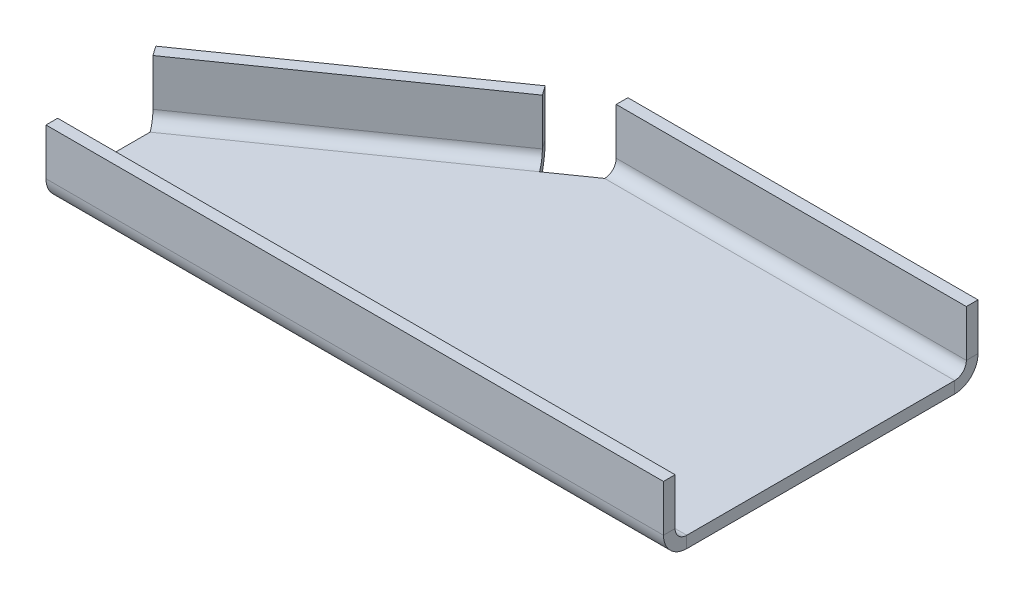
ISO-10303-21;
HEADER;
FILE_DESCRIPTION(('STEP AP214'),'2;1');
FILE_NAME('part.step','',(''),(''),'','','');
FILE_SCHEMA(('AUTOMOTIVE_DESIGN { 1 0 10303 214 1 1 1 1 }'));
ENDSEC;
DATA;
#1=APPLICATION_CONTEXT('core data for automotive mechanical design processes');
#2=APPLICATION_PROTOCOL_DEFINITION('international standard','automotive_design',2000,#1);
#3=PRODUCT_CONTEXT('',#1,'mechanical');
#4=PRODUCT('Part','Part','',(#3));
#5=PRODUCT_RELATED_PRODUCT_CATEGORY('part','',(#4));
#6=PRODUCT_DEFINITION_FORMATION('','',#4);
#7=PRODUCT_DEFINITION_CONTEXT('part definition',#1,'design');
#8=PRODUCT_DEFINITION('design','',#6,#7);
#9=PRODUCT_DEFINITION_SHAPE('','',#8);
#10=(LENGTH_UNIT() NAMED_UNIT(*) SI_UNIT(.MILLI.,.METRE.));
#11=(NAMED_UNIT(*) PLANE_ANGLE_UNIT() SI_UNIT($,.RADIAN.));
#12=(NAMED_UNIT(*) SI_UNIT($,.STERADIAN.) SOLID_ANGLE_UNIT());
#13=UNCERTAINTY_MEASURE_WITH_UNIT(LENGTH_MEASURE(1.E-05),#10,'distance_accuracy_value','');
#14=(GEOMETRIC_REPRESENTATION_CONTEXT(3) GLOBAL_UNCERTAINTY_ASSIGNED_CONTEXT((#13)) GLOBAL_UNIT_ASSIGNED_CONTEXT((#10,
#11,#12)) REPRESENTATION_CONTEXT('',''));
#15=CARTESIAN_POINT('',(0.,0.,0.));
#16=DIRECTION('',(0.,0.,1.));
#17=DIRECTION('',(1.,0.,0.));
#18=AXIS2_PLACEMENT_3D('',#15,#16,#17);
#19=CARTESIAN_POINT('',(168.275,-3.175,-79.375));
#20=DIRECTION('',(1.,0.,0.));
#21=DIRECTION('',(0.,0.,-1.));
#22=AXIS2_PLACEMENT_3D('',#19,#20,#21);
#23=PLANE('',#22);
#24=DIRECTION('',(0.,0.,-1.));
#25=VECTOR('',#24,1.);
#26=CARTESIAN_POINT('',(168.275,0.,-79.375));
#27=LINE('',#26,#25);
#28=CARTESIAN_POINT('',(168.275,0.,-6.34999999999999));
#29=VERTEX_POINT('',#28);
#30=CARTESIAN_POINT('',(168.275,0.,-79.375));
#31=VERTEX_POINT('',#30);
#32=EDGE_CURVE('E143',#29,#31,#27,.T.);
#33=ORIENTED_EDGE('',*,*,#32,.F.);
#34=DIRECTION('',(0.,1.,0.));
#35=VECTOR('',#34,1.);
#36=CARTESIAN_POINT('',(168.275,-3.175,-6.34999999999999));
#37=LINE('',#36,#35);
#38=CARTESIAN_POINT('',(168.275,-3.17500000000001,-6.35));
#39=VERTEX_POINT('',#38);
#40=EDGE_CURVE('E13',#39,#29,#37,.T.);
#41=ORIENTED_EDGE('',*,*,#40,.F.);
#42=DIRECTION('',(0.,0.,-1.));
#43=VECTOR('',#42,1.);
#44=CARTESIAN_POINT('',(168.275,-3.175,-79.375));
#45=LINE('',#44,#43);
#46=CARTESIAN_POINT('',(168.275,-3.175,-79.375));
#47=VERTEX_POINT('',#46);
#48=EDGE_CURVE('E376',#39,#47,#45,.T.);
#49=ORIENTED_EDGE('',*,*,#48,.T.);
#50=DIRECTION('',(0.,1.,0.));
#51=VECTOR('',#50,1.);
#52=CARTESIAN_POINT('',(168.275,-3.175,-79.375));
#53=LINE('',#52,#51);
#54=EDGE_CURVE('E100',#47,#31,#53,.T.);
#55=ORIENTED_EDGE('',*,*,#54,.T.);
#56=EDGE_LOOP('',(#33,#41,#49,#55));
#57=FACE_BOUND('',#56,.T.);
#58=ADVANCED_FACE('F97',(#57),#23,.T.);
#59=CARTESIAN_POINT('',(0.,-3.175,-28.3626254956179));
#60=DIRECTION('',(-1.,0.,0.));
#61=DIRECTION('',(0.,0.,1.));
#62=AXIS2_PLACEMENT_3D('',#59,#60,#61);
#63=PLANE('',#62);
#64=DIRECTION('',(0.,0.,1.));
#65=VECTOR('',#64,1.);
#66=CARTESIAN_POINT('',(0.,0.,-28.3626254956179));
#67=LINE('',#66,#65);
#68=CARTESIAN_POINT('',(0.,0.,-28.3626254956179));
#69=VERTEX_POINT('',#68);
#70=CARTESIAN_POINT('',(0.,0.,-6.35));
#71=VERTEX_POINT('',#70);
#72=EDGE_CURVE('E392',#69,#71,#67,.T.);
#73=ORIENTED_EDGE('',*,*,#72,.F.);
#74=DIRECTION('',(0.,1.,0.));
#75=VECTOR('',#74,1.);
#76=CARTESIAN_POINT('',(0.,-3.175,-28.3626254956179));
#77=LINE('',#76,#75);
#78=CARTESIAN_POINT('',(0.,-3.175,-28.3626254956179));
#79=VERTEX_POINT('',#78);
#80=EDGE_CURVE('E397',#79,#69,#77,.T.);
#81=ORIENTED_EDGE('',*,*,#80,.F.);
#82=DIRECTION('',(0.,0.,1.));
#83=VECTOR('',#82,1.);
#84=CARTESIAN_POINT('',(0.,-3.175,-28.3626254956179));
#85=LINE('',#84,#83);
#86=CARTESIAN_POINT('',(0.,-3.175,-6.35));
#87=VERTEX_POINT('',#86);
#88=EDGE_CURVE('E122',#79,#87,#85,.T.);
#89=ORIENTED_EDGE('',*,*,#88,.T.);
#90=DIRECTION('',(0.,1.,0.));
#91=VECTOR('',#90,1.);
#92=CARTESIAN_POINT('',(0.,-3.175,-6.35));
#93=LINE('',#92,#91);
#94=EDGE_CURVE('E105',#87,#71,#93,.T.);
#95=ORIENTED_EDGE('',*,*,#94,.T.);
#96=EDGE_LOOP('',(#73,#81,#89,#95));
#97=FACE_BOUND('',#96,.T.);
#98=ADVANCED_FACE('F447',(#97),#63,.T.);
#99=CARTESIAN_POINT('',(72.8532209676153,-3.175,-79.375));
#100=DIRECTION('',(-0.573576436351047,0.,-0.819152044288991));
#101=DIRECTION('',(-0.819152044288991,0.,0.573576436351047));
#102=AXIS2_PLACEMENT_3D('',#99,#100,#101);
#103=PLANE('',#102);
#104=DIRECTION('',(0.,-1.,0.));
#105=VECTOR('',#104,1.);
#106=CARTESIAN_POINT('',(62.4193857748211,0.,-72.0691499455677));
#107=LINE('',#106,#105);
#108=CARTESIAN_POINT('',(62.4193857748211,0.,-72.0691499455677));
#109=VERTEX_POINT('',#108);
#110=CARTESIAN_POINT('',(62.4193857748211,-3.17500000000001,-72.0691499455677));
#111=VERTEX_POINT('',#110);
#112=EDGE_CURVE('E113',#109,#111,#107,.T.);
#113=ORIENTED_EDGE('',*,*,#112,.F.);
#114=DIRECTION('',(-0.819152044288991,0.,0.573576436351047));
#115=VECTOR('',#114,1.);
#116=CARTESIAN_POINT('',(72.8532209676153,0.,-79.375));
#117=LINE('',#116,#115);
#118=CARTESIAN_POINT('',(72.8532209676153,0.,-79.375));
#119=VERTEX_POINT('',#118);
#120=EDGE_CURVE('E390',#119,#109,#117,.T.);
#121=ORIENTED_EDGE('',*,*,#120,.F.);
#122=DIRECTION('',(0.,1.,0.));
#123=VECTOR('',#122,1.);
#124=CARTESIAN_POINT('',(72.8532209676153,-3.175,-79.375));
#125=LINE('',#124,#123);
#126=CARTESIAN_POINT('',(72.8532209676153,-3.17500000000004,-79.375));
#127=VERTEX_POINT('',#126);
#128=EDGE_CURVE('E399',#127,#119,#125,.T.);
#129=ORIENTED_EDGE('',*,*,#128,.F.);
#130=DIRECTION('',(-0.819152044288991,0.,0.573576436351047));
#131=VECTOR('',#130,1.);
#132=CARTESIAN_POINT('',(72.8532209676153,-3.175,-79.375));
#133=LINE('',#132,#131);
#134=EDGE_CURVE('E380',#127,#111,#133,.T.);
#135=ORIENTED_EDGE('',*,*,#134,.T.);
#136=EDGE_LOOP('',(#113,#121,#129,#135));
#137=FACE_BOUND('',#136,.T.);
#138=ADVANCED_FACE('F451',(#137),#103,.T.);
#139=CARTESIAN_POINT('',(0.,-3.175,0.));
#140=DIRECTION('',(0.,1.,0.));
#141=DIRECTION('',(0.,0.,1.));
#142=AXIS2_PLACEMENT_3D('',#139,#140,#141);
#143=PLANE('',#142);
#144=ORIENTED_EDGE('',*,*,#48,.F.);
#145=DIRECTION('',(1.,0.,0.));
#146=VECTOR('',#145,1.);
#147=CARTESIAN_POINT('',(0.,-3.175,-6.35));
#148=LINE('',#147,#146);
#149=EDGE_CURVE('E383',#87,#39,#148,.T.);
#150=ORIENTED_EDGE('',*,*,#149,.F.);
#151=ORIENTED_EDGE('',*,*,#88,.F.);
#152=DIRECTION('',(-0.819152044288991,0.,0.573576436351047));
#153=VECTOR('',#152,1.);
#154=CARTESIAN_POINT('',(0.,-3.17500000000002,-28.3626254956179));
#155=LINE('',#154,#153);
#156=EDGE_CURVE('E273',#79,#111,#155,.F.);
#157=ORIENTED_EDGE('',*,*,#156,.T.);
#158=ORIENTED_EDGE('',*,*,#134,.F.);
#159=DIRECTION('',(-1.,0.,0.));
#160=VECTOR('',#159,1.);
#161=CARTESIAN_POINT('',(168.275,-3.175,-79.375));
#162=LINE('',#161,#160);
#163=EDGE_CURVE('E150',#47,#127,#162,.T.);
#164=ORIENTED_EDGE('',*,*,#163,.F.);
#165=EDGE_LOOP('',(#144,#150,#151,#157,#158,#164));
#166=FACE_BOUND('',#165,.T.);
#167=ADVANCED_FACE('F456',(#166),#143,.F.);
#168=CARTESIAN_POINT('',(0.,0.,0.));
#169=DIRECTION('',(0.,1.,0.));
#170=DIRECTION('',(0.,0.,1.));
#171=AXIS2_PLACEMENT_3D('',#168,#169,#170);
#172=PLANE('',#171);
#173=ORIENTED_EDGE('',*,*,#32,.T.);
#174=DIRECTION('',(-1.,0.,0.));
#175=VECTOR('',#174,1.);
#176=CARTESIAN_POINT('',(168.275,0.,-79.375));
#177=LINE('',#176,#175);
#178=EDGE_CURVE('E387',#31,#119,#177,.T.);
#179=ORIENTED_EDGE('',*,*,#178,.T.);
#180=ORIENTED_EDGE('',*,*,#120,.T.);
#181=DIRECTION('',(-0.819152044288991,0.,0.573576436351047));
#182=VECTOR('',#181,1.);
#183=CARTESIAN_POINT('',(0.,0.,-28.362625495618));
#184=LINE('',#183,#182);
#185=EDGE_CURVE('E285',#69,#109,#184,.F.);
#186=ORIENTED_EDGE('',*,*,#185,.F.);
#187=ORIENTED_EDGE('',*,*,#72,.T.);
#188=DIRECTION('',(1.,0.,0.));
#189=VECTOR('',#188,1.);
#190=CARTESIAN_POINT('',(0.,0.,-6.35));
#191=LINE('',#190,#189);
#192=EDGE_CURVE('E378',#71,#29,#191,.T.);
#193=ORIENTED_EDGE('',*,*,#192,.T.);
#194=EDGE_LOOP('',(#173,#179,#180,#186,#187,#193));
#195=FACE_BOUND('',#194,.T.);
#196=ADVANCED_FACE('F410',(#195),#172,.T.);
#197=CARTESIAN_POINT('',(168.275,3.17499999999996,-79.375));
#198=DIRECTION('',(1.,0.,0.));
#199=DIRECTION('',(0.,0.,-1.));
#200=AXIS2_PLACEMENT_3D('',#197,#198,#199);
#201=PLANE('',#200);
#202=DIRECTION('',(0.,0.,1.));
#203=VECTOR('',#202,1.);
#204=CARTESIAN_POINT('',(168.275,3.17500000000001,-85.725));
#205=LINE('',#204,#203);
#206=CARTESIAN_POINT('',(168.275,3.17499999999995,-82.55));
#207=VERTEX_POINT('',#206);
#208=CARTESIAN_POINT('',(168.275,3.17499999999994,-85.725));
#209=VERTEX_POINT('',#208);
#210=EDGE_CURVE('E326',#207,#209,#205,.F.);
#211=ORIENTED_EDGE('',*,*,#210,.F.);
#212=CARTESIAN_POINT('',(168.275,3.17499999999996,-79.375));
#213=DIRECTION('',(-1.,0.,0.));
#214=DIRECTION('',(0.,0.,1.));
#215=AXIS2_PLACEMENT_3D('',#212,#213,#214);
#216=CIRCLE('',#215,3.175);
#217=EDGE_CURVE('E371',#31,#207,#216,.F.);
#218=ORIENTED_EDGE('',*,*,#217,.F.);
#219=ORIENTED_EDGE('',*,*,#54,.F.);
#220=CARTESIAN_POINT('',(168.275,3.17499999999996,-79.375));
#221=DIRECTION('',(-1.,0.,0.));
#222=DIRECTION('',(0.,0.,1.));
#223=AXIS2_PLACEMENT_3D('',#220,#221,#222);
#224=CIRCLE('',#223,6.35);
#225=EDGE_CURVE('E365',#47,#209,#224,.F.);
#226=ORIENTED_EDGE('',*,*,#225,.T.);
#227=EDGE_LOOP('',(#211,#218,#219,#226));
#228=FACE_BOUND('',#227,.T.);
#229=ADVANCED_FACE('F415',(#228),#201,.T.);
#230=CARTESIAN_POINT('',(72.8532209676153,3.17499999999996,-79.375));
#231=DIRECTION('',(1.,0.,0.));
#232=DIRECTION('',(0.,0.,-1.));
#233=AXIS2_PLACEMENT_3D('',#230,#231,#232);
#234=PLANE('',#233);
#235=CARTESIAN_POINT('',(72.8532209676153,3.17499999999996,-79.375));
#236=DIRECTION('',(-1.,0.,0.));
#237=DIRECTION('',(0.,0.,1.));
#238=AXIS2_PLACEMENT_3D('',#235,#236,#237);
#239=CIRCLE('',#238,3.175);
#240=CARTESIAN_POINT('',(72.8532209676153,3.17499999999995,-82.55));
#241=VERTEX_POINT('',#240);
#242=EDGE_CURVE('E338',#241,#119,#239,.T.);
#243=ORIENTED_EDGE('',*,*,#242,.F.);
#244=DIRECTION('',(0.,0.,1.));
#245=VECTOR('',#244,1.);
#246=CARTESIAN_POINT('',(72.8532209676153,3.17499999999998,-82.55));
#247=LINE('',#246,#245);
#248=CARTESIAN_POINT('',(72.8532209676153,3.17500000000001,-85.725));
#249=VERTEX_POINT('',#248);
#250=EDGE_CURVE('E358',#241,#249,#247,.F.);
#251=ORIENTED_EDGE('',*,*,#250,.T.);
#252=CARTESIAN_POINT('',(72.8532209676153,3.17499999999996,-79.375));
#253=DIRECTION('',(-1.,0.,0.));
#254=DIRECTION('',(0.,0.,1.));
#255=AXIS2_PLACEMENT_3D('',#252,#253,#254);
#256=CIRCLE('',#255,6.35);
#257=EDGE_CURVE('E368',#249,#127,#256,.T.);
#258=ORIENTED_EDGE('',*,*,#257,.T.);
#259=ORIENTED_EDGE('',*,*,#128,.T.);
#260=EDGE_LOOP('',(#243,#251,#258,#259));
#261=FACE_BOUND('',#260,.T.);
#262=ADVANCED_FACE('F434',(#261),#234,.F.);
#263=CARTESIAN_POINT('',(72.8532209676153,3.17499999999996,-79.375));
#264=DIRECTION('',(-1.,0.,0.));
#265=DIRECTION('',(0.,0.,-1.));
#266=AXIS2_PLACEMENT_3D('',#263,#264,#265);
#267=CYLINDRICAL_SURFACE('',#266,6.35);
#268=ORIENTED_EDGE('',*,*,#163,.T.);
#269=ORIENTED_EDGE('',*,*,#257,.F.);
#270=DIRECTION('',(-1.,0.,0.));
#271=VECTOR('',#270,1.);
#272=CARTESIAN_POINT('',(168.275,3.17500000000001,-85.725));
#273=LINE('',#272,#271);
#274=EDGE_CURVE('E356',#249,#209,#273,.F.);
#275=ORIENTED_EDGE('',*,*,#274,.T.);
#276=ORIENTED_EDGE('',*,*,#225,.F.);
#277=EDGE_LOOP('',(#268,#269,#275,#276));
#278=FACE_BOUND('',#277,.T.);
#279=ADVANCED_FACE('F465',(#278),#267,.T.);
#280=CARTESIAN_POINT('',(72.8532209676153,3.17499999999996,-79.375));
#281=DIRECTION('',(-1.,0.,0.));
#282=DIRECTION('',(0.,0.,-1.));
#283=AXIS2_PLACEMENT_3D('',#280,#281,#282);
#284=CYLINDRICAL_SURFACE('',#283,3.175);
#285=ORIENTED_EDGE('',*,*,#178,.F.);
#286=ORIENTED_EDGE('',*,*,#217,.T.);
#287=DIRECTION('',(-1.,0.,0.));
#288=VECTOR('',#287,1.);
#289=CARTESIAN_POINT('',(168.275,3.17499999999998,-82.55));
#290=LINE('',#289,#288);
#291=EDGE_CURVE('E361',#207,#241,#290,.T.);
#292=ORIENTED_EDGE('',*,*,#291,.T.);
#293=ORIENTED_EDGE('',*,*,#242,.T.);
#294=EDGE_LOOP('',(#285,#286,#292,#293));
#295=FACE_BOUND('',#294,.T.);
#296=ADVANCED_FACE('F413',(#295),#284,.F.);
#297=CARTESIAN_POINT('',(168.275,0.,-85.725));
#298=DIRECTION('',(-1.,0.,0.));
#299=DIRECTION('',(0.,0.,1.));
#300=AXIS2_PLACEMENT_3D('',#297,#298,#299);
#301=PLANE('',#300);
#302=ORIENTED_EDGE('',*,*,#210,.T.);
#303=DIRECTION('',(0.,-1.,0.));
#304=VECTOR('',#303,1.);
#305=CARTESIAN_POINT('',(168.275,-2.88641209407116E-13,-85.725));
#306=LINE('',#305,#304);
#307=CARTESIAN_POINT('',(168.275,15.875,-85.725));
#308=VERTEX_POINT('',#307);
#309=EDGE_CURVE('E346',#308,#209,#306,.T.);
#310=ORIENTED_EDGE('',*,*,#309,.F.);
#311=DIRECTION('',(0.,0.,1.));
#312=VECTOR('',#311,1.);
#313=CARTESIAN_POINT('',(168.275,15.875,-85.725));
#314=LINE('',#313,#312);
#315=CARTESIAN_POINT('',(168.275,15.875,-82.55));
#316=VERTEX_POINT('',#315);
#317=EDGE_CURVE('E339',#308,#316,#314,.T.);
#318=ORIENTED_EDGE('',*,*,#317,.T.);
#319=DIRECTION('',(0.,1.,0.));
#320=VECTOR('',#319,1.);
#321=CARTESIAN_POINT('',(168.275,0.,-82.55));
#322=LINE('',#321,#320);
#323=EDGE_CURVE('E353',#316,#207,#322,.F.);
#324=ORIENTED_EDGE('',*,*,#323,.T.);
#325=EDGE_LOOP('',(#302,#310,#318,#324));
#326=FACE_BOUND('',#325,.T.);
#327=ADVANCED_FACE('F418',(#326),#301,.F.);
#328=CARTESIAN_POINT('',(72.8532209676153,15.875,-85.725));
#329=DIRECTION('',(1.,0.,0.));
#330=DIRECTION('',(0.,0.,-1.));
#331=AXIS2_PLACEMENT_3D('',#328,#329,#330);
#332=PLANE('',#331);
#333=ORIENTED_EDGE('',*,*,#250,.F.);
#334=DIRECTION('',(0.,-1.,0.));
#335=VECTOR('',#334,1.);
#336=CARTESIAN_POINT('',(72.8532209676153,15.875,-82.55));
#337=LINE('',#336,#335);
#338=CARTESIAN_POINT('',(72.8532209676153,15.875,-82.55));
#339=VERTEX_POINT('',#338);
#340=EDGE_CURVE('E351',#241,#339,#337,.F.);
#341=ORIENTED_EDGE('',*,*,#340,.T.);
#342=DIRECTION('',(0.,0.,1.));
#343=VECTOR('',#342,1.);
#344=CARTESIAN_POINT('',(72.8532209676153,15.875,-85.725));
#345=LINE('',#344,#343);
#346=CARTESIAN_POINT('',(72.8532209676153,15.875,-85.725));
#347=VERTEX_POINT('',#346);
#348=EDGE_CURVE('E335',#347,#339,#345,.T.);
#349=ORIENTED_EDGE('',*,*,#348,.F.);
#350=DIRECTION('',(0.,1.,0.));
#351=VECTOR('',#350,1.);
#352=CARTESIAN_POINT('',(72.8532209676153,-2.88641209407116E-13,-85.725));
#353=LINE('',#352,#351);
#354=EDGE_CURVE('E344',#249,#347,#353,.T.);
#355=ORIENTED_EDGE('',*,*,#354,.F.);
#356=EDGE_LOOP('',(#333,#341,#349,#355));
#357=FACE_BOUND('',#356,.T.);
#358=ADVANCED_FACE('F436',(#357),#332,.F.);
#359=CARTESIAN_POINT('',(0.,-2.88641209407116E-13,-85.725));
#360=DIRECTION('',(0.,0.,1.));
#361=DIRECTION('',(0.,-1.,0.));
#362=AXIS2_PLACEMENT_3D('',#359,#360,#361);
#363=PLANE('',#362);
#364=ORIENTED_EDGE('',*,*,#274,.F.);
#365=ORIENTED_EDGE('',*,*,#354,.T.);
#366=DIRECTION('',(1.,0.,0.));
#367=VECTOR('',#366,1.);
#368=CARTESIAN_POINT('',(0.,15.875,-85.725));
#369=LINE('',#368,#367);
#370=EDGE_CURVE('E342',#347,#308,#369,.T.);
#371=ORIENTED_EDGE('',*,*,#370,.T.);
#372=ORIENTED_EDGE('',*,*,#309,.T.);
#373=EDGE_LOOP('',(#364,#365,#371,#372));
#374=FACE_BOUND('',#373,.T.);
#375=ADVANCED_FACE('F422',(#374),#363,.F.);
#376=CARTESIAN_POINT('',(0.,-2.77555756156289E-13,-82.55));
#377=DIRECTION('',(0.,0.,1.));
#378=DIRECTION('',(0.,-1.,0.));
#379=AXIS2_PLACEMENT_3D('',#376,#377,#378);
#380=PLANE('',#379);
#381=ORIENTED_EDGE('',*,*,#340,.F.);
#382=ORIENTED_EDGE('',*,*,#291,.F.);
#383=ORIENTED_EDGE('',*,*,#323,.F.);
#384=DIRECTION('',(-1.,0.,0.));
#385=VECTOR('',#384,1.);
#386=CARTESIAN_POINT('',(168.275,15.875,-82.55));
#387=LINE('',#386,#385);
#388=EDGE_CURVE('E349',#339,#316,#387,.F.);
#389=ORIENTED_EDGE('',*,*,#388,.F.);
#390=EDGE_LOOP('',(#381,#382,#383,#389));
#391=FACE_BOUND('',#390,.T.);
#392=ADVANCED_FACE('F432',(#391),#380,.T.);
#393=CARTESIAN_POINT('',(168.275,15.875,-85.725));
#394=DIRECTION('',(0.,-1.,0.));
#395=DIRECTION('',(0.,0.,-1.));
#396=AXIS2_PLACEMENT_3D('',#393,#394,#395);
#397=PLANE('',#396);
#398=ORIENTED_EDGE('',*,*,#388,.T.);
#399=ORIENTED_EDGE('',*,*,#317,.F.);
#400=ORIENTED_EDGE('',*,*,#370,.F.);
#401=ORIENTED_EDGE('',*,*,#348,.T.);
#402=EDGE_LOOP('',(#398,#399,#400,#401));
#403=FACE_BOUND('',#402,.T.);
#404=ADVANCED_FACE('F428',(#403),#397,.F.);
#405=CARTESIAN_POINT('',(0.,3.17499999999999,-6.35));
#406=DIRECTION('',(-1.,0.,0.));
#407=DIRECTION('',(0.,0.,1.));
#408=AXIS2_PLACEMENT_3D('',#405,#406,#407);
#409=PLANE('',#408);
#410=DIRECTION('',(0.,0.,-1.));
#411=VECTOR('',#410,1.);
#412=CARTESIAN_POINT('',(0.,3.17499999999999,0.));
#413=LINE('',#412,#411);
#414=CARTESIAN_POINT('',(0.,3.17499999999999,-3.17500000000001));
#415=VERTEX_POINT('',#414);
#416=CARTESIAN_POINT('',(0.,3.17499999999999,0.));
#417=VERTEX_POINT('',#416);
#418=EDGE_CURVE('E292',#415,#417,#413,.F.);
#419=ORIENTED_EDGE('',*,*,#418,.F.);
#420=CARTESIAN_POINT('',(0.,3.17499999999999,-6.35));
#421=DIRECTION('',(1.,0.,0.));
#422=DIRECTION('',(0.,0.,-1.));
#423=AXIS2_PLACEMENT_3D('',#420,#421,#422);
#424=CIRCLE('',#423,3.17499999999999);
#425=EDGE_CURVE('E330',#71,#415,#424,.F.);
#426=ORIENTED_EDGE('',*,*,#425,.F.);
#427=ORIENTED_EDGE('',*,*,#94,.F.);
#428=CARTESIAN_POINT('',(0.,3.17499999999999,-6.35));
#429=DIRECTION('',(1.,0.,0.));
#430=DIRECTION('',(0.,0.,-1.));
#431=AXIS2_PLACEMENT_3D('',#428,#429,#430);
#432=CIRCLE('',#431,6.34999999999999);
#433=EDGE_CURVE('E323',#87,#417,#432,.F.);
#434=ORIENTED_EDGE('',*,*,#433,.T.);
#435=EDGE_LOOP('',(#419,#426,#427,#434));
#436=FACE_BOUND('',#435,.T.);
#437=ADVANCED_FACE('F515',(#436),#409,.T.);
#438=CARTESIAN_POINT('',(168.275,3.17499999999999,-6.35));
#439=DIRECTION('',(-1.,0.,0.));
#440=DIRECTION('',(0.,0.,1.));
#441=AXIS2_PLACEMENT_3D('',#438,#439,#440);
#442=PLANE('',#441);
#443=CARTESIAN_POINT('',(168.275,3.17499999999999,-6.35));
#444=DIRECTION('',(1.,0.,0.));
#445=DIRECTION('',(0.,0.,-1.));
#446=AXIS2_PLACEMENT_3D('',#443,#444,#445);
#447=CIRCLE('',#446,3.17499999999999);
#448=CARTESIAN_POINT('',(168.275,3.17499999999999,-3.17500000000001));
#449=VERTEX_POINT('',#448);
#450=EDGE_CURVE('E296',#449,#29,#447,.T.);
#451=ORIENTED_EDGE('',*,*,#450,.F.);
#452=DIRECTION('',(0.,0.,-1.));
#453=VECTOR('',#452,1.);
#454=CARTESIAN_POINT('',(168.275,3.17499999999999,-3.175));
#455=LINE('',#454,#453);
#456=CARTESIAN_POINT('',(168.275,3.17499999999999,0.));
#457=VERTEX_POINT('',#456);
#458=EDGE_CURVE('E316',#449,#457,#455,.F.);
#459=ORIENTED_EDGE('',*,*,#458,.T.);
#460=CARTESIAN_POINT('',(168.275,3.17499999999999,-6.35));
#461=DIRECTION('',(1.,0.,0.));
#462=DIRECTION('',(0.,0.,-1.));
#463=AXIS2_PLACEMENT_3D('',#460,#461,#462);
#464=CIRCLE('',#463,6.34999999999999);
#465=EDGE_CURVE('E327',#457,#39,#464,.T.);
#466=ORIENTED_EDGE('',*,*,#465,.T.);
#467=ORIENTED_EDGE('',*,*,#40,.T.);
#468=EDGE_LOOP('',(#451,#459,#466,#467));
#469=FACE_BOUND('',#468,.T.);
#470=ADVANCED_FACE('F524',(#469),#442,.F.);
#471=CARTESIAN_POINT('',(168.275,3.17499999999999,-6.35));
#472=DIRECTION('',(1.,0.,0.));
#473=DIRECTION('',(0.,0.,1.));
#474=AXIS2_PLACEMENT_3D('',#471,#472,#473);
#475=CYLINDRICAL_SURFACE('',#474,6.34999999999999);
#476=ORIENTED_EDGE('',*,*,#149,.T.);
#477=ORIENTED_EDGE('',*,*,#465,.F.);
#478=DIRECTION('',(1.,0.,0.));
#479=VECTOR('',#478,1.);
#480=CARTESIAN_POINT('',(0.,3.17499999999999,0.));
#481=LINE('',#480,#479);
#482=EDGE_CURVE('E314',#457,#417,#481,.F.);
#483=ORIENTED_EDGE('',*,*,#482,.T.);
#484=ORIENTED_EDGE('',*,*,#433,.F.);
#485=EDGE_LOOP('',(#476,#477,#483,#484));
#486=FACE_BOUND('',#485,.T.);
#487=ADVANCED_FACE('F535',(#486),#475,.T.);
#488=CARTESIAN_POINT('',(168.275,3.17499999999999,-6.35));
#489=DIRECTION('',(1.,0.,0.));
#490=DIRECTION('',(0.,0.,1.));
#491=AXIS2_PLACEMENT_3D('',#488,#489,#490);
#492=CYLINDRICAL_SURFACE('',#491,3.17499999999999);
#493=ORIENTED_EDGE('',*,*,#192,.F.);
#494=ORIENTED_EDGE('',*,*,#425,.T.);
#495=DIRECTION('',(1.,0.,0.));
#496=VECTOR('',#495,1.);
#497=CARTESIAN_POINT('',(0.,3.17499999999999,-3.175));
#498=LINE('',#497,#496);
#499=EDGE_CURVE('E319',#415,#449,#498,.T.);
#500=ORIENTED_EDGE('',*,*,#499,.T.);
#501=ORIENTED_EDGE('',*,*,#450,.T.);
#502=EDGE_LOOP('',(#493,#494,#500,#501));
#503=FACE_BOUND('',#502,.T.);
#504=ADVANCED_FACE('F546',(#503),#492,.F.);
#505=CARTESIAN_POINT('',(0.,0.,0.));
#506=DIRECTION('',(1.,0.,0.));
#507=DIRECTION('',(0.,1.,0.));
#508=AXIS2_PLACEMENT_3D('',#505,#506,#507);
#509=PLANE('',#508);
#510=ORIENTED_EDGE('',*,*,#418,.T.);
#511=DIRECTION('',(0.,-1.,0.));
#512=VECTOR('',#511,1.);
#513=CARTESIAN_POINT('',(0.,0.,0.));
#514=LINE('',#513,#512);
#515=CARTESIAN_POINT('',(0.,15.875,0.));
#516=VERTEX_POINT('',#515);
#517=EDGE_CURVE('E304',#516,#417,#514,.T.);
#518=ORIENTED_EDGE('',*,*,#517,.F.);
#519=DIRECTION('',(0.,0.,-1.));
#520=VECTOR('',#519,1.);
#521=CARTESIAN_POINT('',(0.,15.875,0.));
#522=LINE('',#521,#520);
#523=CARTESIAN_POINT('',(0.,15.875,-3.17500000000001));
#524=VERTEX_POINT('',#523);
#525=EDGE_CURVE('E297',#516,#524,#522,.T.);
#526=ORIENTED_EDGE('',*,*,#525,.T.);
#527=DIRECTION('',(0.,1.,0.));
#528=VECTOR('',#527,1.);
#529=CARTESIAN_POINT('',(0.,0.,-3.17500000000001));
#530=LINE('',#529,#528);
#531=EDGE_CURVE('E311',#524,#415,#530,.F.);
#532=ORIENTED_EDGE('',*,*,#531,.T.);
#533=EDGE_LOOP('',(#510,#518,#526,#532));
#534=FACE_BOUND('',#533,.T.);
#535=ADVANCED_FACE('F557',(#534),#509,.F.);
#536=CARTESIAN_POINT('',(168.275,15.875,0.));
#537=DIRECTION('',(-1.,0.,0.));
#538=DIRECTION('',(0.,0.,1.));
#539=AXIS2_PLACEMENT_3D('',#536,#537,#538);
#540=PLANE('',#539);
#541=ORIENTED_EDGE('',*,*,#458,.F.);
#542=DIRECTION('',(0.,-1.,0.));
#543=VECTOR('',#542,1.);
#544=CARTESIAN_POINT('',(168.275,15.875,-3.17500000000001));
#545=LINE('',#544,#543);
#546=CARTESIAN_POINT('',(168.275,15.875,-3.17500000000001));
#547=VERTEX_POINT('',#546);
#548=EDGE_CURVE('E309',#449,#547,#545,.F.);
#549=ORIENTED_EDGE('',*,*,#548,.T.);
#550=DIRECTION('',(0.,0.,-1.));
#551=VECTOR('',#550,1.);
#552=CARTESIAN_POINT('',(168.275,15.875,0.));
#553=LINE('',#552,#551);
#554=CARTESIAN_POINT('',(168.275,15.875,0.));
#555=VERTEX_POINT('',#554);
#556=EDGE_CURVE('E293',#555,#547,#553,.T.);
#557=ORIENTED_EDGE('',*,*,#556,.F.);
#558=DIRECTION('',(0.,1.,0.));
#559=VECTOR('',#558,1.);
#560=CARTESIAN_POINT('',(168.275,0.,0.));
#561=LINE('',#560,#559);
#562=EDGE_CURVE('E302',#457,#555,#561,.T.);
#563=ORIENTED_EDGE('',*,*,#562,.F.);
#564=EDGE_LOOP('',(#541,#549,#557,#563));
#565=FACE_BOUND('',#564,.T.);
#566=ADVANCED_FACE('F568',(#565),#540,.F.);
#567=CARTESIAN_POINT('',(0.,0.,0.));
#568=DIRECTION('',(0.,0.,-1.));
#569=DIRECTION('',(-1.,0.,0.));
#570=AXIS2_PLACEMENT_3D('',#567,#568,#569);
#571=PLANE('',#570);
#572=ORIENTED_EDGE('',*,*,#482,.F.);
#573=ORIENTED_EDGE('',*,*,#562,.T.);
#574=DIRECTION('',(-1.,0.,0.));
#575=VECTOR('',#574,1.);
#576=CARTESIAN_POINT('',(0.,15.875,0.));
#577=LINE('',#576,#575);
#578=EDGE_CURVE('E300',#555,#516,#577,.T.);
#579=ORIENTED_EDGE('',*,*,#578,.T.);
#580=ORIENTED_EDGE('',*,*,#517,.T.);
#581=EDGE_LOOP('',(#572,#573,#579,#580));
#582=FACE_BOUND('',#581,.T.);
#583=ADVANCED_FACE('F579',(#582),#571,.F.);
#584=CARTESIAN_POINT('',(0.,0.,-3.17500000000001));
#585=DIRECTION('',(0.,0.,-1.));
#586=DIRECTION('',(-1.,0.,0.));
#587=AXIS2_PLACEMENT_3D('',#584,#585,#586);
#588=PLANE('',#587);
#589=ORIENTED_EDGE('',*,*,#548,.F.);
#590=ORIENTED_EDGE('',*,*,#499,.F.);
#591=ORIENTED_EDGE('',*,*,#531,.F.);
#592=DIRECTION('',(1.,0.,0.));
#593=VECTOR('',#592,1.);
#594=CARTESIAN_POINT('',(0.,15.875,-3.17500000000001));
#595=LINE('',#594,#593);
#596=EDGE_CURVE('E307',#547,#524,#595,.F.);
#597=ORIENTED_EDGE('',*,*,#596,.F.);
#598=EDGE_LOOP('',(#589,#590,#591,#597));
#599=FACE_BOUND('',#598,.T.);
#600=ADVANCED_FACE('F590',(#599),#588,.T.);
#601=CARTESIAN_POINT('',(0.,15.875,0.));
#602=DIRECTION('',(0.,-1.,0.));
#603=DIRECTION('',(0.,0.,-1.));
#604=AXIS2_PLACEMENT_3D('',#601,#602,#603);
#605=PLANE('',#604);
#606=ORIENTED_EDGE('',*,*,#596,.T.);
#607=ORIENTED_EDGE('',*,*,#525,.F.);
#608=ORIENTED_EDGE('',*,*,#578,.F.);
#609=ORIENTED_EDGE('',*,*,#556,.T.);
#610=EDGE_LOOP('',(#606,#607,#608,#609));
#611=FACE_BOUND('',#610,.T.);
#612=ADVANCED_FACE('F601',(#611),#605,.F.);
#613=CARTESIAN_POINT('',(62.4193857748211,3.17499999999999,-72.0691499455677));
#614=DIRECTION('',(0.819152044288991,0.,-0.573576436351047));
#615=DIRECTION('',(-0.573576436351047,0.,-0.819152044288991));
#616=AXIS2_PLACEMENT_3D('',#613,#614,#615);
#617=PLANE('',#616);
#618=DIRECTION('',(0.573576436351047,0.,0.819152044288991));
#619=VECTOR('',#618,1.);
#620=CARTESIAN_POINT('',(58.777175403992,3.17499999999997,-77.2707654268029));
#621=LINE('',#620,#619);
#622=CARTESIAN_POINT('',(60.5982805894065,3.17499999999998,-74.6699576861853));
#623=VERTEX_POINT('',#622);
#624=CARTESIAN_POINT('',(58.777175403992,3.17499999999997,-77.2707654268028));
#625=VERTEX_POINT('',#624);
#626=EDGE_CURVE('E256',#623,#625,#621,.F.);
#627=ORIENTED_EDGE('',*,*,#626,.F.);
#628=CARTESIAN_POINT('',(62.4193857748211,3.17499999999999,-72.0691499455677));
#629=DIRECTION('',(-0.819152044288991,0.,0.573576436351047));
#630=DIRECTION('',(0.573576436351047,0.,0.819152044288991));
#631=AXIS2_PLACEMENT_3D('',#628,#629,#630);
#632=CIRCLE('',#631,3.175);
#633=EDGE_CURVE('E282',#109,#623,#632,.F.);
#634=ORIENTED_EDGE('',*,*,#633,.F.);
#635=ORIENTED_EDGE('',*,*,#112,.T.);
#636=CARTESIAN_POINT('',(62.4193857748211,3.17499999999999,-72.0691499455677));
#637=DIRECTION('',(-0.819152044288991,0.,0.573576436351047));
#638=DIRECTION('',(0.573576436351047,0.,0.819152044288991));
#639=AXIS2_PLACEMENT_3D('',#636,#637,#638);
#640=CIRCLE('',#639,6.35);
#641=EDGE_CURVE('E276',#111,#625,#640,.F.);
#642=ORIENTED_EDGE('',*,*,#641,.T.);
#643=EDGE_LOOP('',(#627,#634,#635,#642));
#644=FACE_BOUND('',#643,.T.);
#645=ADVANCED_FACE('F612',(#644),#617,.T.);
#646=CARTESIAN_POINT('',(0.,3.17499999999999,-28.362625495618));
#647=DIRECTION('',(0.819152044288991,0.,-0.573576436351047));
#648=DIRECTION('',(-0.573576436351047,0.,-0.819152044288991));
#649=AXIS2_PLACEMENT_3D('',#646,#647,#648);
#650=PLANE('',#649);
#651=CARTESIAN_POINT('',(0.,3.17499999999999,-28.362625495618));
#652=DIRECTION('',(-0.819152044288991,0.,0.573576436351047));
#653=DIRECTION('',(0.573576436351047,0.,0.819152044288991));
#654=AXIS2_PLACEMENT_3D('',#651,#652,#653);
#655=CIRCLE('',#654,3.175);
#656=CARTESIAN_POINT('',(-1.82110518541458,3.17499999999998,-30.9634332362355));
#657=VERTEX_POINT('',#656);
#658=EDGE_CURVE('E288',#657,#69,#655,.T.);
#659=ORIENTED_EDGE('',*,*,#658,.F.);
#660=DIRECTION('',(0.573576436351047,0.,0.819152044288991));
#661=VECTOR('',#660,1.);
#662=CARTESIAN_POINT('',(-1.82110518541458,3.17499999999998,-30.9634332362355));
#663=LINE('',#662,#661);
#664=CARTESIAN_POINT('',(-3.64221037082916,3.17499999999997,-33.564240976853));
#665=VERTEX_POINT('',#664);
#666=EDGE_CURVE('E267',#657,#665,#663,.F.);
#667=ORIENTED_EDGE('',*,*,#666,.T.);
#668=CARTESIAN_POINT('',(0.,3.17499999999999,-28.362625495618));
#669=DIRECTION('',(-0.819152044288991,0.,0.573576436351047));
#670=DIRECTION('',(0.573576436351047,0.,0.819152044288991));
#671=AXIS2_PLACEMENT_3D('',#668,#669,#670);
#672=CIRCLE('',#671,6.35);
#673=EDGE_CURVE('E277',#665,#79,#672,.T.);
#674=ORIENTED_EDGE('',*,*,#673,.T.);
#675=ORIENTED_EDGE('',*,*,#80,.T.);
#676=EDGE_LOOP('',(#659,#667,#674,#675));
#677=FACE_BOUND('',#676,.T.);
#678=ADVANCED_FACE('F623',(#677),#650,.F.);
#679=CARTESIAN_POINT('',(0.,3.17499999999999,-28.362625495618));
#680=DIRECTION('',(-0.819152044288991,0.,0.573576436351047));
#681=DIRECTION('',(-0.573576436351047,0.,-0.819152044288991));
#682=AXIS2_PLACEMENT_3D('',#679,#680,#681);
#683=CYLINDRICAL_SURFACE('',#682,6.35);
#684=ORIENTED_EDGE('',*,*,#156,.F.);
#685=ORIENTED_EDGE('',*,*,#673,.F.);
#686=DIRECTION('',(-0.819152044288991,0.,0.573576436351047));
#687=VECTOR('',#686,1.);
#688=CARTESIAN_POINT('',(58.777175403992,3.17499999999997,-77.2707654268028));
#689=LINE('',#688,#687);
#690=EDGE_CURVE('E265',#665,#625,#689,.F.);
#691=ORIENTED_EDGE('',*,*,#690,.T.);
#692=ORIENTED_EDGE('',*,*,#641,.F.);
#693=EDGE_LOOP('',(#684,#685,#691,#692));
#694=FACE_BOUND('',#693,.T.);
#695=ADVANCED_FACE('F634',(#694),#683,.T.);
#696=CARTESIAN_POINT('',(0.,3.17499999999999,-28.362625495618));
#697=DIRECTION('',(-0.819152044288991,0.,0.573576436351047));
#698=DIRECTION('',(-0.573576436351047,0.,-0.819152044288991));
#699=AXIS2_PLACEMENT_3D('',#696,#697,#698);
#700=CYLINDRICAL_SURFACE('',#699,3.175);
#701=ORIENTED_EDGE('',*,*,#185,.T.);
#702=ORIENTED_EDGE('',*,*,#633,.T.);
#703=DIRECTION('',(-0.819152044288991,0.,0.573576436351047));
#704=VECTOR('',#703,1.);
#705=CARTESIAN_POINT('',(60.5982805894065,3.17499999999998,-74.6699576861853));
#706=LINE('',#705,#704);
#707=EDGE_CURVE('E270',#623,#657,#706,.T.);
#708=ORIENTED_EDGE('',*,*,#707,.T.);
#709=ORIENTED_EDGE('',*,*,#658,.T.);
#710=EDGE_LOOP('',(#701,#702,#708,#709));
#711=FACE_BOUND('',#710,.T.);
#712=ADVANCED_FACE('F645',(#711),#700,.F.);
#713=CARTESIAN_POINT('',(58.777175403992,0.,-77.2707654268028));
#714=DIRECTION('',(-0.819152044288991,0.,0.573576436351047));
#715=DIRECTION('',(0.573576436351047,0.,0.819152044288991));
#716=AXIS2_PLACEMENT_3D('',#713,#714,#715);
#717=PLANE('',#716);
#718=ORIENTED_EDGE('',*,*,#626,.T.);
#719=DIRECTION('',(0.,-1.,0.));
#720=VECTOR('',#719,1.);
#721=CARTESIAN_POINT('',(58.777175403992,0.,-77.2707654268028));
#722=LINE('',#721,#720);
#723=CARTESIAN_POINT('',(58.7771754039919,15.875,-77.2707654268029));
#724=VERTEX_POINT('',#723);
#725=EDGE_CURVE('E237',#724,#625,#722,.T.);
#726=ORIENTED_EDGE('',*,*,#725,.F.);
#727=DIRECTION('',(0.573576436351047,0.,0.819152044288991));
#728=VECTOR('',#727,1.);
#729=CARTESIAN_POINT('',(58.7771754039919,15.875,-77.2707654268029));
#730=LINE('',#729,#728);
#731=CARTESIAN_POINT('',(60.5982805894065,15.875,-74.6699576861853));
#732=VERTEX_POINT('',#731);
#733=EDGE_CURVE('E243',#724,#732,#730,.T.);
#734=ORIENTED_EDGE('',*,*,#733,.T.);
#735=DIRECTION('',(0.,1.,0.));
#736=VECTOR('',#735,1.);
#737=CARTESIAN_POINT('',(60.5982805894065,0.,-74.6699576861853));
#738=LINE('',#737,#736);
#739=EDGE_CURVE('E263',#732,#623,#738,.F.);
#740=ORIENTED_EDGE('',*,*,#739,.T.);
#741=EDGE_LOOP('',(#718,#726,#734,#740));
#742=FACE_BOUND('',#741,.T.);
#743=ADVANCED_FACE('F255',(#742),#717,.F.);
#744=CARTESIAN_POINT('',(-3.64221037082918,15.875,-33.5642409768531));
#745=DIRECTION('',(0.819152044288991,0.,-0.573576436351047));
#746=DIRECTION('',(-0.573576436351047,0.,-0.819152044288991));
#747=AXIS2_PLACEMENT_3D('',#744,#745,#746);
#748=PLANE('',#747);
#749=ORIENTED_EDGE('',*,*,#666,.F.);
#750=DIRECTION('',(0.,-1.,0.));
#751=VECTOR('',#750,1.);
#752=CARTESIAN_POINT('',(-1.82110518541461,15.875,-30.9634332362355));
#753=LINE('',#752,#751);
#754=CARTESIAN_POINT('',(-1.82110518541461,15.875,-30.9634332362355));
#755=VERTEX_POINT('',#754);
#756=EDGE_CURVE('E259',#657,#755,#753,.F.);
#757=ORIENTED_EDGE('',*,*,#756,.T.);
#758=DIRECTION('',(0.573576436351047,0.,0.819152044288991));
#759=VECTOR('',#758,1.);
#760=CARTESIAN_POINT('',(-3.64221037082919,15.875,-33.5642409768531));
#761=LINE('',#760,#759);
#762=CARTESIAN_POINT('',(-3.64221037082918,15.875,-33.5642409768531));
#763=VERTEX_POINT('',#762);
#764=EDGE_CURVE('E252',#763,#755,#761,.T.);
#765=ORIENTED_EDGE('',*,*,#764,.F.);
#766=DIRECTION('',(0.,1.,0.));
#767=VECTOR('',#766,1.);
#768=CARTESIAN_POINT('',(-3.64221037082915,0.,-33.564240976853));
#769=LINE('',#768,#767);
#770=EDGE_CURVE('E239',#665,#763,#769,.T.);
#771=ORIENTED_EDGE('',*,*,#770,.F.);
#772=EDGE_LOOP('',(#749,#757,#765,#771));
#773=FACE_BOUND('',#772,.T.);
#774=ADVANCED_FACE('F666',(#773),#748,.F.);
#775=CARTESIAN_POINT('',(-16.9682853130024,0.,-24.2332228475958));
#776=DIRECTION('',(0.573576436351047,0.,0.819152044288991));
#777=DIRECTION('',(0.819152044288991,0.,-0.573576436351047));
#778=AXIS2_PLACEMENT_3D('',#775,#776,#777);
#779=PLANE('',#778);
#780=ORIENTED_EDGE('',*,*,#690,.F.);
#781=ORIENTED_EDGE('',*,*,#770,.T.);
#782=DIRECTION('',(0.819152044288991,0.,-0.573576436351047));
#783=VECTOR('',#782,1.);
#784=CARTESIAN_POINT('',(-16.9682853130024,15.875,-24.2332228475958));
#785=LINE('',#784,#783);
#786=EDGE_CURVE('E232',#763,#724,#785,.T.);
#787=ORIENTED_EDGE('',*,*,#786,.T.);
#788=ORIENTED_EDGE('',*,*,#725,.T.);
#789=EDGE_LOOP('',(#780,#781,#787,#788));
#790=FACE_BOUND('',#789,.T.);
#791=ADVANCED_FACE('F235',(#790),#779,.F.);
#792=CARTESIAN_POINT('',(-15.1471801275878,0.,-21.6324151069782));
#793=DIRECTION('',(0.573576436351047,0.,0.819152044288991));
#794=DIRECTION('',(0.819152044288991,0.,-0.573576436351047));
#795=AXIS2_PLACEMENT_3D('',#792,#793,#794);
#796=PLANE('',#795);
#797=ORIENTED_EDGE('',*,*,#756,.F.);
#798=ORIENTED_EDGE('',*,*,#707,.F.);
#799=ORIENTED_EDGE('',*,*,#739,.F.);
#800=DIRECTION('',(-0.819152044288991,0.,0.573576436351047));
#801=VECTOR('',#800,1.);
#802=CARTESIAN_POINT('',(60.5982805894065,15.875,-74.6699576861853));
#803=LINE('',#802,#801);
#804=EDGE_CURVE('E248',#755,#732,#803,.F.);
#805=ORIENTED_EDGE('',*,*,#804,.F.);
#806=EDGE_LOOP('',(#797,#798,#799,#805));
#807=FACE_BOUND('',#806,.T.);
#808=ADVANCED_FACE('F686',(#807),#796,.T.);
#809=CARTESIAN_POINT('',(58.7771754039919,15.875,-77.2707654268029));
#810=DIRECTION('',(0.,-1.,0.));
#811=DIRECTION('',(0.,0.,-1.));
#812=AXIS2_PLACEMENT_3D('',#809,#810,#811);
#813=PLANE('',#812);
#814=ORIENTED_EDGE('',*,*,#804,.T.);
#815=ORIENTED_EDGE('',*,*,#733,.F.);
#816=ORIENTED_EDGE('',*,*,#786,.F.);
#817=ORIENTED_EDGE('',*,*,#764,.T.);
#818=EDGE_LOOP('',(#814,#815,#816,#817));
#819=FACE_BOUND('',#818,.T.);
#820=ADVANCED_FACE('F246',(#819),#813,.F.);
#821=CLOSED_SHELL('',(#58,#98,#138,#167,#196,#229,#262,#279,#296,#327,#358,#375,#392,#404,#437,
#470,#487,#504,#535,#566,#583,#600,#612,#645,#678,#695,#712,#743,#774,#791,#808,#820));
#822=MANIFOLD_SOLID_BREP('B2',#821);
#823=ADVANCED_BREP_SHAPE_REPRESENTATION('',(#18,#822),#14);
#824=SHAPE_DEFINITION_REPRESENTATION(#9,#823);
ENDSEC;
END-ISO-10303-21;
